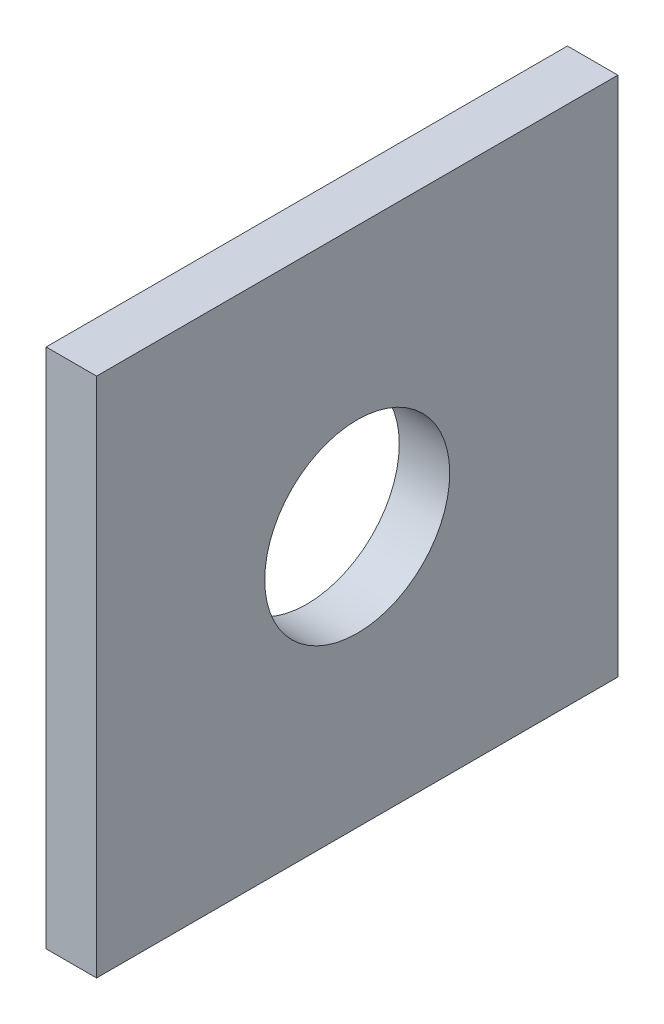
ISO-10303-21;
HEADER;
FILE_DESCRIPTION(('STEP AP214'),'2;1');
FILE_NAME('part.step','',(''),(''),'','','');
FILE_SCHEMA(('AUTOMOTIVE_DESIGN { 1 0 10303 214 1 1 1 1 }'));
ENDSEC;
DATA;
#1=APPLICATION_CONTEXT('core data for automotive mechanical design processes');
#2=APPLICATION_PROTOCOL_DEFINITION('international standard','automotive_design',2000,#1);
#3=PRODUCT_CONTEXT('',#1,'mechanical');
#4=PRODUCT('Part','Part','',(#3));
#5=PRODUCT_RELATED_PRODUCT_CATEGORY('part','',(#4));
#6=PRODUCT_DEFINITION_FORMATION('','',#4);
#7=PRODUCT_DEFINITION_CONTEXT('part definition',#1,'design');
#8=PRODUCT_DEFINITION('design','',#6,#7);
#9=PRODUCT_DEFINITION_SHAPE('','',#8);
#10=(LENGTH_UNIT() NAMED_UNIT(*) SI_UNIT(.MILLI.,.METRE.));
#11=(NAMED_UNIT(*) PLANE_ANGLE_UNIT() SI_UNIT($,.RADIAN.));
#12=(NAMED_UNIT(*) SI_UNIT($,.STERADIAN.) SOLID_ANGLE_UNIT());
#13=UNCERTAINTY_MEASURE_WITH_UNIT(LENGTH_MEASURE(1.E-05),#10,'distance_accuracy_value','');
#14=(GEOMETRIC_REPRESENTATION_CONTEXT(3) GLOBAL_UNCERTAINTY_ASSIGNED_CONTEXT((#13)) GLOBAL_UNIT_ASSIGNED_CONTEXT((#10,
#11,#12)) REPRESENTATION_CONTEXT('',''));
#15=CARTESIAN_POINT('',(0.,0.,0.));
#16=DIRECTION('',(0.,0.,1.));
#17=DIRECTION('',(1.,0.,0.));
#18=AXIS2_PLACEMENT_3D('',#15,#16,#17);
#19=CARTESIAN_POINT('',(-6.,-31.,31.));
#20=DIRECTION('',(0.,0.,1.));
#21=DIRECTION('',(0.,-1.,0.));
#22=AXIS2_PLACEMENT_3D('',#19,#20,#21);
#23=PLANE('',#22);
#24=DIRECTION('',(0.,-1.,0.));
#25=VECTOR('',#24,1.);
#26=CARTESIAN_POINT('',(0.,-31.,31.));
#27=LINE('',#26,#25);
#28=CARTESIAN_POINT('',(0.,31.,31.));
#29=VERTEX_POINT('',#28);
#30=CARTESIAN_POINT('',(0.,-31.,31.));
#31=VERTEX_POINT('',#30);
#32=EDGE_CURVE('E97',#29,#31,#27,.T.);
#33=ORIENTED_EDGE('',*,*,#32,.F.);
#34=DIRECTION('',(1.,0.,0.));
#35=VECTOR('',#34,1.);
#36=CARTESIAN_POINT('',(-6.,31.,31.));
#37=LINE('',#36,#35);
#38=CARTESIAN_POINT('',(-6.,31.,31.));
#39=VERTEX_POINT('',#38);
#40=EDGE_CURVE('E11',#39,#29,#37,.T.);
#41=ORIENTED_EDGE('',*,*,#40,.F.);
#42=DIRECTION('',(0.,-1.,0.));
#43=VECTOR('',#42,1.);
#44=CARTESIAN_POINT('',(-6.,-31.,31.));
#45=LINE('',#44,#43);
#46=CARTESIAN_POINT('',(-6.,-31.,31.));
#47=VERTEX_POINT('',#46);
#48=EDGE_CURVE('E90',#39,#47,#45,.T.);
#49=ORIENTED_EDGE('',*,*,#48,.T.);
#50=DIRECTION('',(1.,0.,0.));
#51=VECTOR('',#50,1.);
#52=CARTESIAN_POINT('',(-6.,-31.,31.));
#53=LINE('',#52,#51);
#54=EDGE_CURVE('E35',#47,#31,#53,.T.);
#55=ORIENTED_EDGE('',*,*,#54,.T.);
#56=EDGE_LOOP('',(#33,#41,#49,#55));
#57=FACE_BOUND('',#56,.T.);
#58=ADVANCED_FACE('F32',(#57),#23,.T.);
#59=CARTESIAN_POINT('',(-6.,31.,31.));
#60=DIRECTION('',(0.,1.,0.));
#61=DIRECTION('',(0.,0.,1.));
#62=AXIS2_PLACEMENT_3D('',#59,#60,#61);
#63=PLANE('',#62);
#64=DIRECTION('',(0.,0.,1.));
#65=VECTOR('',#64,1.);
#66=CARTESIAN_POINT('',(0.,31.,31.));
#67=LINE('',#66,#65);
#68=CARTESIAN_POINT('',(0.,31.,-31.));
#69=VERTEX_POINT('',#68);
#70=EDGE_CURVE('E92',#69,#29,#67,.T.);
#71=ORIENTED_EDGE('',*,*,#70,.F.);
#72=DIRECTION('',(1.,0.,0.));
#73=VECTOR('',#72,1.);
#74=CARTESIAN_POINT('',(-6.,31.,-31.));
#75=LINE('',#74,#73);
#76=CARTESIAN_POINT('',(-6.,31.,-31.));
#77=VERTEX_POINT('',#76);
#78=EDGE_CURVE('E41',#77,#69,#75,.T.);
#79=ORIENTED_EDGE('',*,*,#78,.F.);
#80=DIRECTION('',(0.,0.,1.));
#81=VECTOR('',#80,1.);
#82=CARTESIAN_POINT('',(-6.,31.,31.));
#83=LINE('',#82,#81);
#84=EDGE_CURVE('E87',#77,#39,#83,.T.);
#85=ORIENTED_EDGE('',*,*,#84,.T.);
#86=ORIENTED_EDGE('',*,*,#40,.T.);
#87=EDGE_LOOP('',(#71,#79,#85,#86));
#88=FACE_BOUND('',#87,.T.);
#89=ADVANCED_FACE('F108',(#88),#63,.T.);
#90=CARTESIAN_POINT('',(-6.,-31.,-31.));
#91=DIRECTION('',(0.,0.,-1.));
#92=DIRECTION('',(0.,1.,0.));
#93=AXIS2_PLACEMENT_3D('',#90,#91,#92);
#94=PLANE('',#93);
#95=DIRECTION('',(0.,1.,0.));
#96=VECTOR('',#95,1.);
#97=CARTESIAN_POINT('',(0.,-31.,-31.));
#98=LINE('',#97,#96);
#99=CARTESIAN_POINT('',(0.,-31.,-31.));
#100=VERTEX_POINT('',#99);
#101=EDGE_CURVE('E82',#100,#69,#98,.T.);
#102=ORIENTED_EDGE('',*,*,#101,.F.);
#103=DIRECTION('',(1.,0.,0.));
#104=VECTOR('',#103,1.);
#105=CARTESIAN_POINT('',(-6.,-31.,-31.));
#106=LINE('',#105,#104);
#107=CARTESIAN_POINT('',(-6.,-31.,-31.));
#108=VERTEX_POINT('',#107);
#109=EDGE_CURVE('E77',#108,#100,#106,.T.);
#110=ORIENTED_EDGE('',*,*,#109,.F.);
#111=DIRECTION('',(0.,1.,0.));
#112=VECTOR('',#111,1.);
#113=CARTESIAN_POINT('',(-6.,-31.,-31.));
#114=LINE('',#113,#112);
#115=EDGE_CURVE('E80',#108,#77,#114,.T.);
#116=ORIENTED_EDGE('',*,*,#115,.T.);
#117=ORIENTED_EDGE('',*,*,#78,.T.);
#118=EDGE_LOOP('',(#102,#110,#116,#117));
#119=FACE_BOUND('',#118,.T.);
#120=ADVANCED_FACE('F79',(#119),#94,.T.);
#121=CARTESIAN_POINT('',(-6.,-31.,31.));
#122=DIRECTION('',(0.,-1.,0.));
#123=DIRECTION('',(0.,0.,-1.));
#124=AXIS2_PLACEMENT_3D('',#121,#122,#123);
#125=PLANE('',#124);
#126=DIRECTION('',(0.,0.,-1.));
#127=VECTOR('',#126,1.);
#128=CARTESIAN_POINT('',(0.,-31.,31.));
#129=LINE('',#128,#127);
#130=EDGE_CURVE('E100',#31,#100,#129,.T.);
#131=ORIENTED_EDGE('',*,*,#130,.F.);
#132=ORIENTED_EDGE('',*,*,#54,.F.);
#133=DIRECTION('',(0.,0.,-1.));
#134=VECTOR('',#133,1.);
#135=CARTESIAN_POINT('',(-6.,-31.,31.));
#136=LINE('',#135,#134);
#137=EDGE_CURVE('E86',#47,#108,#136,.T.);
#138=ORIENTED_EDGE('',*,*,#137,.T.);
#139=ORIENTED_EDGE('',*,*,#109,.T.);
#140=EDGE_LOOP('',(#131,#132,#138,#139));
#141=FACE_BOUND('',#140,.T.);
#142=ADVANCED_FACE('F89',(#141),#125,.T.);
#143=CARTESIAN_POINT('',(-6.,31.,31.));
#144=DIRECTION('',(-1.,0.,0.));
#145=DIRECTION('',(0.,0.,1.));
#146=AXIS2_PLACEMENT_3D('',#143,#144,#145);
#147=PLANE('',#146);
#148=CARTESIAN_POINT('',(-6.,0.,0.));
#149=DIRECTION('',(1.,0.,0.));
#150=DIRECTION('',(0.,0.,-1.));
#151=AXIS2_PLACEMENT_3D('',#148,#149,#150);
#152=CIRCLE('',#151,11.);
#153=CARTESIAN_POINT('',(-6.,0.,-11.));
#154=VERTEX_POINT('',#153);
#155=EDGE_CURVE('E101',#154,#154,#152,.T.);
#156=ORIENTED_EDGE('',*,*,#155,.T.);
#157=EDGE_LOOP('',(#156));
#158=FACE_BOUND('',#157,.T.);
#159=ORIENTED_EDGE('',*,*,#48,.F.);
#160=ORIENTED_EDGE('',*,*,#84,.F.);
#161=ORIENTED_EDGE('',*,*,#115,.F.);
#162=ORIENTED_EDGE('',*,*,#137,.F.);
#163=EDGE_LOOP('',(#159,#160,#161,#162));
#164=FACE_BOUND('',#163,.T.);
#165=ADVANCED_FACE('F85',(#158,#164),#147,.T.);
#166=CARTESIAN_POINT('',(0.,31.,31.));
#167=DIRECTION('',(-1.,0.,0.));
#168=DIRECTION('',(0.,0.,1.));
#169=AXIS2_PLACEMENT_3D('',#166,#167,#168);
#170=PLANE('',#169);
#171=CARTESIAN_POINT('',(0.,0.,0.));
#172=DIRECTION('',(1.,0.,0.));
#173=DIRECTION('',(0.,0.,-1.));
#174=AXIS2_PLACEMENT_3D('',#171,#172,#173);
#175=CIRCLE('',#174,11.);
#176=CARTESIAN_POINT('',(0.,0.,-11.));
#177=VERTEX_POINT('',#176);
#178=EDGE_CURVE('E138',#177,#177,#175,.T.);
#179=ORIENTED_EDGE('',*,*,#178,.F.);
#180=EDGE_LOOP('',(#179));
#181=FACE_BOUND('',#180,.T.);
#182=ORIENTED_EDGE('',*,*,#32,.T.);
#183=ORIENTED_EDGE('',*,*,#130,.T.);
#184=ORIENTED_EDGE('',*,*,#101,.T.);
#185=ORIENTED_EDGE('',*,*,#70,.T.);
#186=EDGE_LOOP('',(#182,#183,#184,#185));
#187=FACE_BOUND('',#186,.T.);
#188=ADVANCED_FACE('F107',(#181,#187),#170,.F.);
#189=CARTESIAN_POINT('',(-6.,0.,0.));
#190=DIRECTION('',(1.,0.,0.));
#191=DIRECTION('',(0.,0.,-1.));
#192=AXIS2_PLACEMENT_3D('',#189,#190,#191);
#193=CYLINDRICAL_SURFACE('',#192,11.);
#194=ORIENTED_EDGE('',*,*,#155,.F.);
#195=EDGE_LOOP('',(#194));
#196=FACE_BOUND('',#195,.T.);
#197=ORIENTED_EDGE('',*,*,#178,.T.);
#198=EDGE_LOOP('',(#197));
#199=FACE_BOUND('',#198,.T.);
#200=ADVANCED_FACE('F126',(#196,#199),#193,.F.);
#201=CLOSED_SHELL('',(#58,#89,#120,#142,#165,#188,#200));
#202=MANIFOLD_SOLID_BREP('B2',#201);
#203=ADVANCED_BREP_SHAPE_REPRESENTATION('',(#18,#202),#14);
#204=SHAPE_DEFINITION_REPRESENTATION(#9,#203);
ENDSEC;
END-ISO-10303-21;
